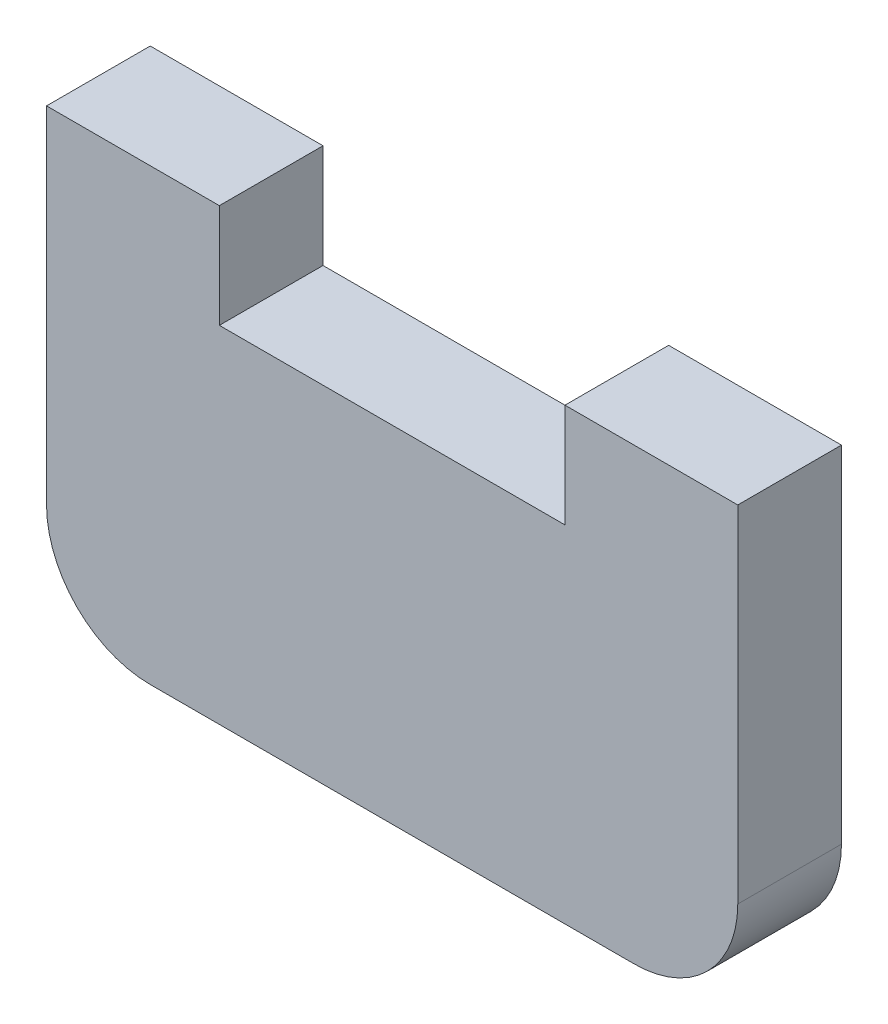
ISO-10303-21;
HEADER;
FILE_DESCRIPTION(('STEP AP214'),'2;1');
FILE_NAME('part.step','',(''),(''),'','','');
FILE_SCHEMA(('AUTOMOTIVE_DESIGN { 1 0 10303 214 1 1 1 1 }'));
ENDSEC;
DATA;
#1=APPLICATION_CONTEXT('core data for automotive mechanical design processes');
#2=APPLICATION_PROTOCOL_DEFINITION('international standard','automotive_design',2000,#1);
#3=PRODUCT_CONTEXT('',#1,'mechanical');
#4=PRODUCT('Part','Part','',(#3));
#5=PRODUCT_RELATED_PRODUCT_CATEGORY('part','',(#4));
#6=PRODUCT_DEFINITION_FORMATION('','',#4);
#7=PRODUCT_DEFINITION_CONTEXT('part definition',#1,'design');
#8=PRODUCT_DEFINITION('design','',#6,#7);
#9=PRODUCT_DEFINITION_SHAPE('','',#8);
#10=(LENGTH_UNIT() NAMED_UNIT(*) SI_UNIT(.MILLI.,.METRE.));
#11=(NAMED_UNIT(*) PLANE_ANGLE_UNIT() SI_UNIT($,.RADIAN.));
#12=(NAMED_UNIT(*) SI_UNIT($,.STERADIAN.) SOLID_ANGLE_UNIT());
#13=UNCERTAINTY_MEASURE_WITH_UNIT(LENGTH_MEASURE(1.E-05),#10,'distance_accuracy_value','');
#14=(GEOMETRIC_REPRESENTATION_CONTEXT(3) GLOBAL_UNCERTAINTY_ASSIGNED_CONTEXT((#13)) GLOBAL_UNIT_ASSIGNED_CONTEXT((#10,
#11,#12)) REPRESENTATION_CONTEXT('',''));
#15=CARTESIAN_POINT('',(0.,0.,0.));
#16=DIRECTION('',(0.,0.,1.));
#17=DIRECTION('',(1.,0.,0.));
#18=AXIS2_PLACEMENT_3D('',#15,#16,#17);
#19=CARTESIAN_POINT('',(-5.,22.0010272230946,3.));
#20=DIRECTION('',(1.,0.,0.));
#21=DIRECTION('',(0.,1.,0.));
#22=AXIS2_PLACEMENT_3D('',#19,#20,#21);
#23=PLANE('',#22);
#24=DIRECTION('',(0.,-1.,0.));
#25=VECTOR('',#24,1.);
#26=CARTESIAN_POINT('',(-5.,22.0010272230946,0.));
#27=LINE('',#26,#25);
#28=CARTESIAN_POINT('',(-5.,22.0010272230946,0.));
#29=VERTEX_POINT('',#28);
#30=CARTESIAN_POINT('',(-5.,12.0010272230947,0.));
#31=VERTEX_POINT('',#30);
#32=EDGE_CURVE('E141',#29,#31,#27,.T.);
#33=ORIENTED_EDGE('',*,*,#32,.T.);
#34=DIRECTION('',(0.,0.,-1.));
#35=VECTOR('',#34,1.);
#36=CARTESIAN_POINT('',(-5.,12.0010272230947,3.));
#37=LINE('',#36,#35);
#38=CARTESIAN_POINT('',(-5.,12.0010272230947,3.));
#39=VERTEX_POINT('',#38);
#40=EDGE_CURVE('E11',#39,#31,#37,.T.);
#41=ORIENTED_EDGE('',*,*,#40,.F.);
#42=DIRECTION('',(0.,-1.,0.));
#43=VECTOR('',#42,1.);
#44=CARTESIAN_POINT('',(-5.,22.0010272230946,3.));
#45=LINE('',#44,#43);
#46=CARTESIAN_POINT('',(-5.,22.0010272230946,3.));
#47=VERTEX_POINT('',#46);
#48=EDGE_CURVE('E159',#47,#39,#45,.T.);
#49=ORIENTED_EDGE('',*,*,#48,.F.);
#50=DIRECTION('',(0.,0.,-1.));
#51=VECTOR('',#50,1.);
#52=CARTESIAN_POINT('',(-5.,22.0010272230946,3.));
#53=LINE('',#52,#51);
#54=EDGE_CURVE('E137',#47,#29,#53,.T.);
#55=ORIENTED_EDGE('',*,*,#54,.T.);
#56=EDGE_LOOP('',(#33,#41,#49,#55));
#57=FACE_BOUND('',#56,.T.);
#58=ADVANCED_FACE('F33',(#57),#23,.F.);
#59=CARTESIAN_POINT('',(-2.,12.0010272230946,3.));
#60=DIRECTION('',(0.,0.,-1.));
#61=DIRECTION('',(-1.,0.,0.));
#62=AXIS2_PLACEMENT_3D('',#59,#60,#61);
#63=CYLINDRICAL_SURFACE('',#62,3.);
#64=CARTESIAN_POINT('',(-2.,12.0010272230946,0.));
#65=DIRECTION('',(0.,0.,1.));
#66=DIRECTION('',(1.,0.,0.));
#67=AXIS2_PLACEMENT_3D('',#64,#65,#66);
#68=CIRCLE('',#67,3.);
#69=CARTESIAN_POINT('',(-1.99999999999998,9.00102722309465,0.));
#70=VERTEX_POINT('',#69);
#71=EDGE_CURVE('E144',#31,#70,#68,.T.);
#72=ORIENTED_EDGE('',*,*,#71,.T.);
#73=DIRECTION('',(0.,0.,-1.));
#74=VECTOR('',#73,1.);
#75=CARTESIAN_POINT('',(-1.99999999999998,9.00102722309465,3.));
#76=LINE('',#75,#74);
#77=CARTESIAN_POINT('',(-1.99999999999998,9.00102722309465,3.));
#78=VERTEX_POINT('',#77);
#79=EDGE_CURVE('E41',#78,#70,#76,.T.);
#80=ORIENTED_EDGE('',*,*,#79,.F.);
#81=CARTESIAN_POINT('',(-2.,12.0010272230946,3.));
#82=DIRECTION('',(0.,0.,1.));
#83=DIRECTION('',(1.,0.,0.));
#84=AXIS2_PLACEMENT_3D('',#81,#82,#83);
#85=CIRCLE('',#84,3.);
#86=EDGE_CURVE('E98',#39,#78,#85,.T.);
#87=ORIENTED_EDGE('',*,*,#86,.F.);
#88=ORIENTED_EDGE('',*,*,#40,.T.);
#89=EDGE_LOOP('',(#72,#80,#87,#88));
#90=FACE_BOUND('',#89,.T.);
#91=ADVANCED_FACE('F208',(#90),#63,.T.);
#92=CARTESIAN_POINT('',(-1.99999999999998,9.00102722309465,3.));
#93=DIRECTION('',(0.,1.,0.));
#94=DIRECTION('',(-1.,0.,0.));
#95=AXIS2_PLACEMENT_3D('',#92,#93,#94);
#96=PLANE('',#95);
#97=DIRECTION('',(1.,0.,0.));
#98=VECTOR('',#97,1.);
#99=CARTESIAN_POINT('',(-1.99999999999998,9.00102722309465,0.));
#100=LINE('',#99,#98);
#101=CARTESIAN_POINT('',(12.,9.00102722309465,0.));
#102=VERTEX_POINT('',#101);
#103=EDGE_CURVE('E146',#70,#102,#100,.T.);
#104=ORIENTED_EDGE('',*,*,#103,.T.);
#105=DIRECTION('',(0.,0.,-1.));
#106=VECTOR('',#105,1.);
#107=CARTESIAN_POINT('',(12.,9.00102722309465,3.));
#108=LINE('',#107,#106);
#109=CARTESIAN_POINT('',(12.,9.00102722309465,3.));
#110=VERTEX_POINT('',#109);
#111=EDGE_CURVE('E172',#110,#102,#108,.T.);
#112=ORIENTED_EDGE('',*,*,#111,.F.);
#113=DIRECTION('',(1.,0.,0.));
#114=VECTOR('',#113,1.);
#115=CARTESIAN_POINT('',(-1.99999999999998,9.00102722309465,3.));
#116=LINE('',#115,#114);
#117=EDGE_CURVE('E180',#78,#110,#116,.T.);
#118=ORIENTED_EDGE('',*,*,#117,.F.);
#119=ORIENTED_EDGE('',*,*,#79,.T.);
#120=EDGE_LOOP('',(#104,#112,#118,#119));
#121=FACE_BOUND('',#120,.T.);
#122=ADVANCED_FACE('F178',(#121),#96,.F.);
#123=CARTESIAN_POINT('',(12.,12.0010272230946,3.));
#124=DIRECTION('',(0.,0.,-1.));
#125=DIRECTION('',(-1.,0.,0.));
#126=AXIS2_PLACEMENT_3D('',#123,#124,#125);
#127=CYLINDRICAL_SURFACE('',#126,3.);
#128=CARTESIAN_POINT('',(12.,12.0010272230946,0.));
#129=DIRECTION('',(0.,0.,1.));
#130=DIRECTION('',(1.,0.,0.));
#131=AXIS2_PLACEMENT_3D('',#128,#129,#130);
#132=CIRCLE('',#131,3.);
#133=CARTESIAN_POINT('',(15.,12.0010272230947,0.));
#134=VERTEX_POINT('',#133);
#135=EDGE_CURVE('E148',#102,#134,#132,.T.);
#136=ORIENTED_EDGE('',*,*,#135,.T.);
#137=DIRECTION('',(0.,0.,-1.));
#138=VECTOR('',#137,1.);
#139=CARTESIAN_POINT('',(15.,12.0010272230947,3.));
#140=LINE('',#139,#138);
#141=CARTESIAN_POINT('',(15.,12.0010272230947,3.));
#142=VERTEX_POINT('',#141);
#143=EDGE_CURVE('E169',#142,#134,#140,.T.);
#144=ORIENTED_EDGE('',*,*,#143,.F.);
#145=CARTESIAN_POINT('',(12.,12.0010272230946,3.));
#146=DIRECTION('',(0.,0.,1.));
#147=DIRECTION('',(1.,0.,0.));
#148=AXIS2_PLACEMENT_3D('',#145,#146,#147);
#149=CIRCLE('',#148,3.);
#150=EDGE_CURVE('E198',#110,#142,#149,.T.);
#151=ORIENTED_EDGE('',*,*,#150,.F.);
#152=ORIENTED_EDGE('',*,*,#111,.T.);
#153=EDGE_LOOP('',(#136,#144,#151,#152));
#154=FACE_BOUND('',#153,.T.);
#155=ADVANCED_FACE('F189',(#154),#127,.T.);
#156=CARTESIAN_POINT('',(15.,12.0010272230947,3.));
#157=DIRECTION('',(-1.,0.,0.));
#158=DIRECTION('',(0.,0.,1.));
#159=AXIS2_PLACEMENT_3D('',#156,#157,#158);
#160=PLANE('',#159);
#161=DIRECTION('',(0.,1.,0.));
#162=VECTOR('',#161,1.);
#163=CARTESIAN_POINT('',(15.,12.0010272230947,0.));
#164=LINE('',#163,#162);
#165=CARTESIAN_POINT('',(15.,22.0010272230946,0.));
#166=VERTEX_POINT('',#165);
#167=EDGE_CURVE('E150',#134,#166,#164,.T.);
#168=ORIENTED_EDGE('',*,*,#167,.T.);
#169=DIRECTION('',(0.,0.,-1.));
#170=VECTOR('',#169,1.);
#171=CARTESIAN_POINT('',(15.,22.0010272230946,3.));
#172=LINE('',#171,#170);
#173=CARTESIAN_POINT('',(15.,22.0010272230946,3.));
#174=VERTEX_POINT('',#173);
#175=EDGE_CURVE('E166',#174,#166,#172,.T.);
#176=ORIENTED_EDGE('',*,*,#175,.F.);
#177=DIRECTION('',(0.,1.,0.));
#178=VECTOR('',#177,1.);
#179=CARTESIAN_POINT('',(15.,12.0010272230947,3.));
#180=LINE('',#179,#178);
#181=EDGE_CURVE('E195',#142,#174,#180,.T.);
#182=ORIENTED_EDGE('',*,*,#181,.F.);
#183=ORIENTED_EDGE('',*,*,#143,.T.);
#184=EDGE_LOOP('',(#168,#176,#182,#183));
#185=FACE_BOUND('',#184,.T.);
#186=ADVANCED_FACE('F193',(#185),#160,.F.);
#187=CARTESIAN_POINT('',(15.,22.0010272230946,3.));
#188=DIRECTION('',(0.,-1.,0.));
#189=DIRECTION('',(0.,0.,-1.));
#190=AXIS2_PLACEMENT_3D('',#187,#188,#189);
#191=PLANE('',#190);
#192=DIRECTION('',(-1.,0.,0.));
#193=VECTOR('',#192,1.);
#194=CARTESIAN_POINT('',(15.,22.0010272230946,0.));
#195=LINE('',#194,#193);
#196=CARTESIAN_POINT('',(10.,22.0010272230946,0.));
#197=VERTEX_POINT('',#196);
#198=EDGE_CURVE('E152',#166,#197,#195,.T.);
#199=ORIENTED_EDGE('',*,*,#198,.T.);
#200=DIRECTION('',(0.,0.,-1.));
#201=VECTOR('',#200,1.);
#202=CARTESIAN_POINT('',(10.,22.0010272230946,3.));
#203=LINE('',#202,#201);
#204=CARTESIAN_POINT('',(10.,22.0010272230946,3.));
#205=VERTEX_POINT('',#204);
#206=EDGE_CURVE('E163',#205,#197,#203,.T.);
#207=ORIENTED_EDGE('',*,*,#206,.F.);
#208=DIRECTION('',(-1.,0.,0.));
#209=VECTOR('',#208,1.);
#210=CARTESIAN_POINT('',(15.,22.0010272230946,3.));
#211=LINE('',#210,#209);
#212=EDGE_CURVE('E197',#174,#205,#211,.T.);
#213=ORIENTED_EDGE('',*,*,#212,.F.);
#214=ORIENTED_EDGE('',*,*,#175,.T.);
#215=EDGE_LOOP('',(#199,#207,#213,#214));
#216=FACE_BOUND('',#215,.T.);
#217=ADVANCED_FACE('F220',(#216),#191,.F.);
#218=CARTESIAN_POINT('',(10.,22.0010272230946,3.));
#219=DIRECTION('',(1.,0.,0.));
#220=DIRECTION('',(0.,1.,0.));
#221=AXIS2_PLACEMENT_3D('',#218,#219,#220);
#222=PLANE('',#221);
#223=DIRECTION('',(0.,-1.,0.));
#224=VECTOR('',#223,1.);
#225=CARTESIAN_POINT('',(10.,22.0010272230946,0.));
#226=LINE('',#225,#224);
#227=CARTESIAN_POINT('',(10.,19.0010272230946,0.));
#228=VERTEX_POINT('',#227);
#229=EDGE_CURVE('E154',#197,#228,#226,.T.);
#230=ORIENTED_EDGE('',*,*,#229,.T.);
#231=DIRECTION('',(0.,0.,-1.));
#232=VECTOR('',#231,1.);
#233=CARTESIAN_POINT('',(10.,19.0010272230946,3.));
#234=LINE('',#233,#232);
#235=CARTESIAN_POINT('',(10.,19.0010272230946,3.));
#236=VERTEX_POINT('',#235);
#237=EDGE_CURVE('E132',#236,#228,#234,.T.);
#238=ORIENTED_EDGE('',*,*,#237,.F.);
#239=DIRECTION('',(0.,-1.,0.));
#240=VECTOR('',#239,1.);
#241=CARTESIAN_POINT('',(10.,22.0010272230946,3.));
#242=LINE('',#241,#240);
#243=EDGE_CURVE('E123',#205,#236,#242,.T.);
#244=ORIENTED_EDGE('',*,*,#243,.F.);
#245=ORIENTED_EDGE('',*,*,#206,.T.);
#246=EDGE_LOOP('',(#230,#238,#244,#245));
#247=FACE_BOUND('',#246,.T.);
#248=ADVANCED_FACE('F223',(#247),#222,.F.);
#249=CARTESIAN_POINT('',(10.,19.0010272230946,3.));
#250=DIRECTION('',(0.,-1.,0.));
#251=DIRECTION('',(0.,0.,-1.));
#252=AXIS2_PLACEMENT_3D('',#249,#250,#251);
#253=PLANE('',#252);
#254=DIRECTION('',(-1.,0.,0.));
#255=VECTOR('',#254,1.);
#256=CARTESIAN_POINT('',(10.,19.0010272230946,0.));
#257=LINE('',#256,#255);
#258=CARTESIAN_POINT('',(0.,19.0010272230946,0.));
#259=VERTEX_POINT('',#258);
#260=EDGE_CURVE('E131',#228,#259,#257,.T.);
#261=ORIENTED_EDGE('',*,*,#260,.T.);
#262=DIRECTION('',(0.,0.,-1.));
#263=VECTOR('',#262,1.);
#264=CARTESIAN_POINT('',(0.,19.0010272230946,3.));
#265=LINE('',#264,#263);
#266=CARTESIAN_POINT('',(0.,19.0010272230946,3.));
#267=VERTEX_POINT('',#266);
#268=EDGE_CURVE('E128',#267,#259,#265,.T.);
#269=ORIENTED_EDGE('',*,*,#268,.F.);
#270=DIRECTION('',(-1.,0.,0.));
#271=VECTOR('',#270,1.);
#272=CARTESIAN_POINT('',(10.,19.0010272230946,3.));
#273=LINE('',#272,#271);
#274=EDGE_CURVE('E117',#236,#267,#273,.T.);
#275=ORIENTED_EDGE('',*,*,#274,.F.);
#276=ORIENTED_EDGE('',*,*,#237,.T.);
#277=EDGE_LOOP('',(#261,#269,#275,#276));
#278=FACE_BOUND('',#277,.T.);
#279=ADVANCED_FACE('F129',(#278),#253,.F.);
#280=CARTESIAN_POINT('',(0.,19.0010272230946,3.));
#281=DIRECTION('',(-1.,0.,0.));
#282=DIRECTION('',(0.,0.,1.));
#283=AXIS2_PLACEMENT_3D('',#280,#281,#282);
#284=PLANE('',#283);
#285=DIRECTION('',(0.,1.,0.));
#286=VECTOR('',#285,1.);
#287=CARTESIAN_POINT('',(0.,19.0010272230946,0.));
#288=LINE('',#287,#286);
#289=CARTESIAN_POINT('',(0.,22.0010272230946,0.));
#290=VERTEX_POINT('',#289);
#291=EDGE_CURVE('E84',#259,#290,#288,.T.);
#292=ORIENTED_EDGE('',*,*,#291,.T.);
#293=DIRECTION('',(0.,0.,-1.));
#294=VECTOR('',#293,1.);
#295=CARTESIAN_POINT('',(0.,22.0010272230946,3.));
#296=LINE('',#295,#294);
#297=CARTESIAN_POINT('',(0.,22.0010272230946,3.));
#298=VERTEX_POINT('',#297);
#299=EDGE_CURVE('E133',#298,#290,#296,.T.);
#300=ORIENTED_EDGE('',*,*,#299,.F.);
#301=DIRECTION('',(0.,1.,0.));
#302=VECTOR('',#301,1.);
#303=CARTESIAN_POINT('',(0.,19.0010272230946,3.));
#304=LINE('',#303,#302);
#305=EDGE_CURVE('E121',#267,#298,#304,.T.);
#306=ORIENTED_EDGE('',*,*,#305,.F.);
#307=ORIENTED_EDGE('',*,*,#268,.T.);
#308=EDGE_LOOP('',(#292,#300,#306,#307));
#309=FACE_BOUND('',#308,.T.);
#310=ADVANCED_FACE('F135',(#309),#284,.F.);
#311=CARTESIAN_POINT('',(0.,22.0010272230946,3.));
#312=DIRECTION('',(0.,-1.,0.));
#313=DIRECTION('',(0.,0.,-1.));
#314=AXIS2_PLACEMENT_3D('',#311,#312,#313);
#315=PLANE('',#314);
#316=DIRECTION('',(-1.,0.,0.));
#317=VECTOR('',#316,1.);
#318=CARTESIAN_POINT('',(0.,22.0010272230946,0.));
#319=LINE('',#318,#317);
#320=EDGE_CURVE('E90',#290,#29,#319,.T.);
#321=ORIENTED_EDGE('',*,*,#320,.T.);
#322=ORIENTED_EDGE('',*,*,#54,.F.);
#323=DIRECTION('',(-1.,0.,0.));
#324=VECTOR('',#323,1.);
#325=CARTESIAN_POINT('',(0.,22.0010272230946,3.));
#326=LINE('',#325,#324);
#327=EDGE_CURVE('E49',#298,#47,#326,.T.);
#328=ORIENTED_EDGE('',*,*,#327,.F.);
#329=ORIENTED_EDGE('',*,*,#299,.T.);
#330=EDGE_LOOP('',(#321,#322,#328,#329));
#331=FACE_BOUND('',#330,.T.);
#332=ADVANCED_FACE('F232',(#331),#315,.F.);
#333=CARTESIAN_POINT('',(-2.,12.0010272230946,3.));
#334=DIRECTION('',(0.,0.,1.));
#335=DIRECTION('',(1.,0.,0.));
#336=AXIS2_PLACEMENT_3D('',#333,#334,#335);
#337=PLANE('',#336);
#338=ORIENTED_EDGE('',*,*,#48,.T.);
#339=ORIENTED_EDGE('',*,*,#86,.T.);
#340=ORIENTED_EDGE('',*,*,#117,.T.);
#341=ORIENTED_EDGE('',*,*,#150,.T.);
#342=ORIENTED_EDGE('',*,*,#181,.T.);
#343=ORIENTED_EDGE('',*,*,#212,.T.);
#344=ORIENTED_EDGE('',*,*,#243,.T.);
#345=ORIENTED_EDGE('',*,*,#274,.T.);
#346=ORIENTED_EDGE('',*,*,#305,.T.);
#347=ORIENTED_EDGE('',*,*,#327,.T.);
#348=EDGE_LOOP('',(#338,#339,#340,#341,#342,#343,#344,#345,#346,#347));
#349=FACE_BOUND('',#348,.T.);
#350=ADVANCED_FACE('F119',(#349),#337,.T.);
#351=CARTESIAN_POINT('',(-2.,12.0010272230946,0.));
#352=DIRECTION('',(0.,0.,1.));
#353=DIRECTION('',(1.,0.,0.));
#354=AXIS2_PLACEMENT_3D('',#351,#352,#353);
#355=PLANE('',#354);
#356=ORIENTED_EDGE('',*,*,#32,.F.);
#357=ORIENTED_EDGE('',*,*,#320,.F.);
#358=ORIENTED_EDGE('',*,*,#291,.F.);
#359=ORIENTED_EDGE('',*,*,#260,.F.);
#360=ORIENTED_EDGE('',*,*,#229,.F.);
#361=ORIENTED_EDGE('',*,*,#198,.F.);
#362=ORIENTED_EDGE('',*,*,#167,.F.);
#363=ORIENTED_EDGE('',*,*,#135,.F.);
#364=ORIENTED_EDGE('',*,*,#103,.F.);
#365=ORIENTED_EDGE('',*,*,#71,.F.);
#366=EDGE_LOOP('',(#356,#357,#358,#359,#360,#361,#362,#363,#364,#365));
#367=FACE_BOUND('',#366,.T.);
#368=ADVANCED_FACE('F184',(#367),#355,.F.);
#369=CLOSED_SHELL('',(#58,#91,#122,#155,#186,#217,#248,#279,#310,#332,#350,#368));
#370=MANIFOLD_SOLID_BREP('B2',#369);
#371=ADVANCED_BREP_SHAPE_REPRESENTATION('',(#18,#370),#14);
#372=SHAPE_DEFINITION_REPRESENTATION(#9,#371);
ENDSEC;
END-ISO-10303-21;
